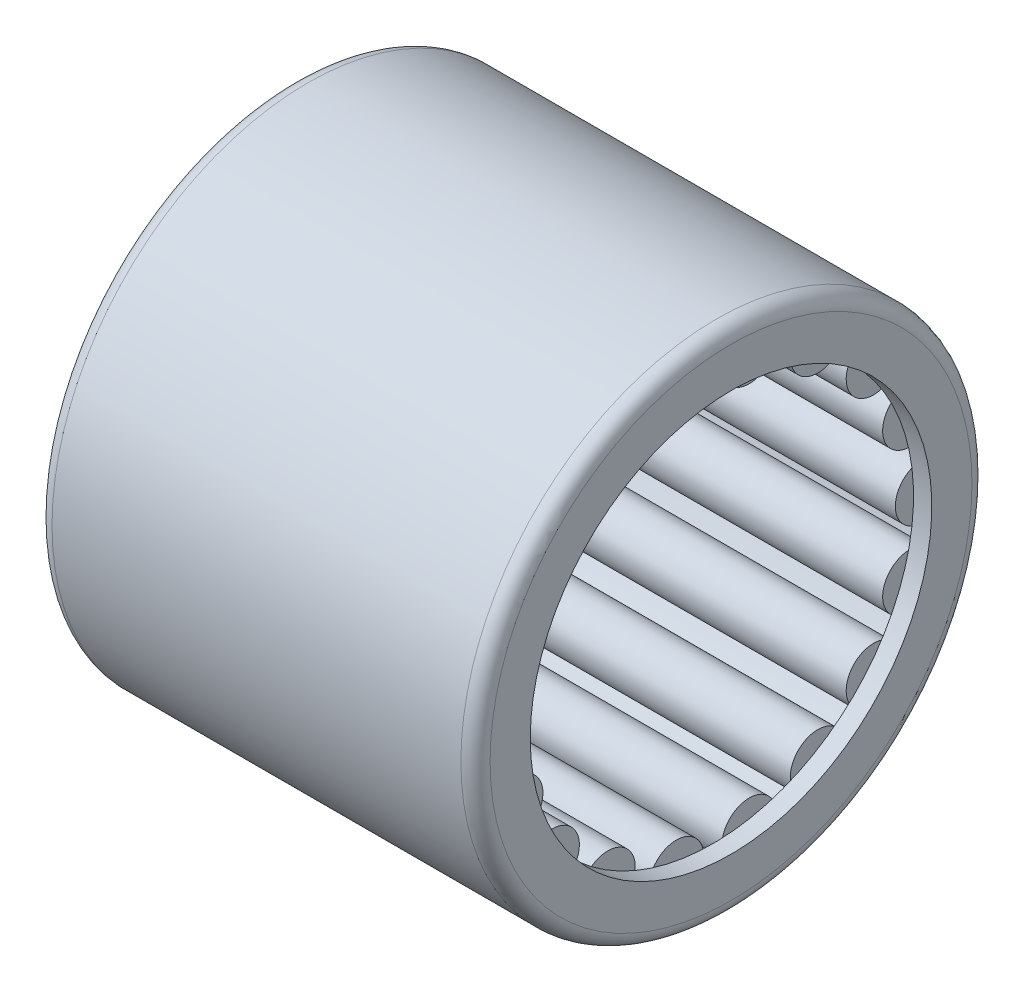
ISO-10303-21;
HEADER;
FILE_DESCRIPTION(('STEP AP214'),'2;1');
FILE_NAME('part.step','',(''),(''),'','','');
FILE_SCHEMA(('AUTOMOTIVE_DESIGN { 1 0 10303 214 1 1 1 1 }'));
ENDSEC;
DATA;
#1=APPLICATION_CONTEXT('core data for automotive mechanical design processes');
#2=APPLICATION_PROTOCOL_DEFINITION('international standard','automotive_design',2000,#1);
#3=PRODUCT_CONTEXT('',#1,'mechanical');
#4=PRODUCT('Part','Part','',(#3));
#5=PRODUCT_RELATED_PRODUCT_CATEGORY('part','',(#4));
#6=PRODUCT_DEFINITION_FORMATION('','',#4);
#7=PRODUCT_DEFINITION_CONTEXT('part definition',#1,'design');
#8=PRODUCT_DEFINITION('design','',#6,#7);
#9=PRODUCT_DEFINITION_SHAPE('','',#8);
#10=(LENGTH_UNIT() NAMED_UNIT(*) SI_UNIT(.MILLI.,.METRE.));
#11=(NAMED_UNIT(*) PLANE_ANGLE_UNIT() SI_UNIT($,.RADIAN.));
#12=(NAMED_UNIT(*) SI_UNIT($,.STERADIAN.) SOLID_ANGLE_UNIT());
#13=UNCERTAINTY_MEASURE_WITH_UNIT(LENGTH_MEASURE(1.E-05),#10,'distance_accuracy_value','');
#14=(GEOMETRIC_REPRESENTATION_CONTEXT(3) GLOBAL_UNCERTAINTY_ASSIGNED_CONTEXT((#13)) GLOBAL_UNIT_ASSIGNED_CONTEXT((#10,
#11,#12)) REPRESENTATION_CONTEXT('',''));
#15=CARTESIAN_POINT('',(0.,0.,0.));
#16=DIRECTION('',(0.,0.,1.));
#17=DIRECTION('',(1.,0.,0.));
#18=AXIS2_PLACEMENT_3D('',#15,#16,#17);
#19=CARTESIAN_POINT('',(-7.62132034355963,1.96661582412253,-5.403232569519));
#20=DIRECTION('',(1.,0.,0.));
#21=DIRECTION('',(0.,0.342020143325657,-0.939692620785913));
#22=AXIS2_PLACEMENT_3D('',#19,#20,#21);
#23=CYLINDRICAL_SURFACE('',#22,0.75);
#24=CARTESIAN_POINT('',(5.5,1.96661582412253,-5.403232569519));
#25=DIRECTION('',(-1.,0.,0.));
#26=DIRECTION('',(0.,-0.342020143325657,0.939692620785913));
#27=AXIS2_PLACEMENT_3D('',#24,#25,#26);
#28=CIRCLE('',#27,0.75);
#29=CARTESIAN_POINT('',(5.5,1.71010071662828,-4.69846310392956));
#30=VERTEX_POINT('',#29);
#31=EDGE_CURVE('E57',#30,#30,#28,.T.);
#32=ORIENTED_EDGE('',*,*,#31,.T.);
#33=EDGE_LOOP('',(#32));
#34=FACE_BOUND('',#33,.T.);
#35=CARTESIAN_POINT('',(-5.49999999999999,1.96661582412253,-5.403232569519));
#36=DIRECTION('',(-1.,0.,0.));
#37=DIRECTION('',(0.,-0.342020143325657,0.939692620785913));
#38=AXIS2_PLACEMENT_3D('',#35,#36,#37);
#39=CIRCLE('',#38,0.75);
#40=CARTESIAN_POINT('',(-5.49999999999999,1.71010071662828,-4.69846310392956));
#41=VERTEX_POINT('',#40);
#42=EDGE_CURVE('E11',#41,#41,#39,.T.);
#43=ORIENTED_EDGE('',*,*,#42,.F.);
#44=EDGE_LOOP('',(#43));
#45=FACE_BOUND('',#44,.T.);
#46=ADVANCED_FACE('F50',(#34,#45),#23,.T.);
#47=CARTESIAN_POINT('',(5.5,1.96661582412253,-5.403232569519));
#48=DIRECTION('',(-1.,0.,0.));
#49=DIRECTION('',(0.,-0.342020143325657,0.939692620785913));
#50=AXIS2_PLACEMENT_3D('',#47,#48,#49);
#51=PLANE('',#50);
#52=ORIENTED_EDGE('',*,*,#31,.F.);
#53=EDGE_LOOP('',(#52));
#54=FACE_BOUND('',#53,.T.);
#55=ADVANCED_FACE('F65',(#54),#51,.F.);
#56=CARTESIAN_POINT('',(-5.49999999999999,5.16830941432251,1.88111078829111));
#57=DIRECTION('',(-1.,0.,0.));
#58=DIRECTION('',(0.,-0.342020143325657,0.939692620785913));
#59=AXIS2_PLACEMENT_3D('',#56,#57,#58);
#60=PLANE('',#59);
#61=ORIENTED_EDGE('',*,*,#42,.T.);
#62=EDGE_LOOP('',(#61));
#63=FACE_BOUND('',#62,.T.);
#64=ADVANCED_FACE('F52',(#63),#60,.T.);
#65=CLOSED_SHELL('',(#46,#55,#64));
#66=MANIFOLD_SOLID_BREP('B2',#65);
#67=CARTESIAN_POINT('',(-7.62132034355963,3.69602875569755,-4.40475554793417));
#68=DIRECTION('',(1.,0.,0.));
#69=DIRECTION('',(0.,0.64278760968653,-0.766044443118986));
#70=AXIS2_PLACEMENT_3D('',#67,#68,#69);
#71=CYLINDRICAL_SURFACE('',#70,0.75);
#72=CARTESIAN_POINT('',(5.5,3.69602875569755,-4.40475554793417));
#73=DIRECTION('',(-1.,0.,0.));
#74=DIRECTION('',(0.,-0.64278760968653,0.766044443118986));
#75=AXIS2_PLACEMENT_3D('',#72,#73,#74);
#76=CIRCLE('',#75,0.75);
#77=CARTESIAN_POINT('',(5.5,3.21393804843265,-3.83022221559493));
#78=VERTEX_POINT('',#77);
#79=EDGE_CURVE('E112',#78,#78,#76,.T.);
#80=ORIENTED_EDGE('',*,*,#79,.T.);
#81=EDGE_LOOP('',(#80));
#82=FACE_BOUND('',#81,.T.);
#83=CARTESIAN_POINT('',(-5.49999999999999,3.69602875569755,-4.40475554793417));
#84=DIRECTION('',(-1.,0.,0.));
#85=DIRECTION('',(0.,-0.64278760968653,0.766044443118986));
#86=AXIS2_PLACEMENT_3D('',#83,#84,#85);
#87=CIRCLE('',#86,0.75);
#88=CARTESIAN_POINT('',(-5.49999999999999,3.21393804843265,-3.83022221559493));
#89=VERTEX_POINT('',#88);
#90=EDGE_CURVE('E49',#89,#89,#87,.T.);
#91=ORIENTED_EDGE('',*,*,#90,.F.);
#92=EDGE_LOOP('',(#91));
#93=FACE_BOUND('',#92,.T.);
#94=ADVANCED_FACE('F105',(#82,#93),#71,.T.);
#95=CARTESIAN_POINT('',(5.5,3.69602875569755,-4.40475554793417));
#96=DIRECTION('',(-1.,0.,0.));
#97=DIRECTION('',(0.,-0.64278760968653,0.766044443118986));
#98=AXIS2_PLACEMENT_3D('',#95,#96,#97);
#99=PLANE('',#98);
#100=ORIENTED_EDGE('',*,*,#79,.F.);
#101=EDGE_LOOP('',(#100));
#102=FACE_BOUND('',#101,.T.);
#103=ADVANCED_FACE('F120',(#102),#99,.F.);
#104=CARTESIAN_POINT('',(-5.49999999999999,4.21324443715442,3.53533185327591));
#105=DIRECTION('',(-1.,0.,0.));
#106=DIRECTION('',(0.,-0.64278760968653,0.766044443118986));
#107=AXIS2_PLACEMENT_3D('',#104,#105,#106);
#108=PLANE('',#107);
#109=ORIENTED_EDGE('',*,*,#90,.T.);
#110=EDGE_LOOP('',(#109));
#111=FACE_BOUND('',#110,.T.);
#112=ADVANCED_FACE('F107',(#111),#108,.T.);
#113=CLOSED_SHELL('',(#94,#103,#112));
#114=MANIFOLD_SOLID_BREP('B6',#113);
#115=CARTESIAN_POINT('',(-7.62132034355963,4.97964607176049,-2.87500000000006));
#116=DIRECTION('',(1.,0.,0.));
#117=DIRECTION('',(0.,0.866025403784433,-0.50000000000001));
#118=AXIS2_PLACEMENT_3D('',#115,#116,#117);
#119=CYLINDRICAL_SURFACE('',#118,0.75);
#120=CARTESIAN_POINT('',(5.5,4.97964607176049,-2.87500000000006));
#121=DIRECTION('',(-1.,0.,0.));
#122=DIRECTION('',(0.,-0.866025403784433,0.50000000000001));
#123=AXIS2_PLACEMENT_3D('',#120,#121,#122);
#124=CIRCLE('',#123,0.75);
#125=CARTESIAN_POINT('',(5.5,4.33012701892216,-2.50000000000005));
#126=VERTEX_POINT('',#125);
#127=EDGE_CURVE('E167',#126,#126,#124,.T.);
#128=ORIENTED_EDGE('',*,*,#127,.T.);
#129=EDGE_LOOP('',(#128));
#130=FACE_BOUND('',#129,.T.);
#131=CARTESIAN_POINT('',(-5.49999999999999,4.97964607176049,-2.87500000000006));
#132=DIRECTION('',(-1.,0.,0.));
#133=DIRECTION('',(0.,-0.866025403784433,0.50000000000001));
#134=AXIS2_PLACEMENT_3D('',#131,#132,#133);
#135=CIRCLE('',#134,0.75);
#136=CARTESIAN_POINT('',(-5.49999999999999,4.33012701892216,-2.50000000000005));
#137=VERTEX_POINT('',#136);
#138=EDGE_CURVE('E104',#137,#137,#135,.T.);
#139=ORIENTED_EDGE('',*,*,#138,.F.);
#140=EDGE_LOOP('',(#139));
#141=FACE_BOUND('',#140,.T.);
#142=ADVANCED_FACE('F160',(#130,#141),#119,.T.);
#143=CARTESIAN_POINT('',(5.5,4.97964607176049,-2.87500000000006));
#144=DIRECTION('',(-1.,0.,0.));
#145=DIRECTION('',(0.,-0.866025403784433,0.50000000000001));
#146=AXIS2_PLACEMENT_3D('',#143,#144,#145);
#147=PLANE('',#146);
#148=ORIENTED_EDGE('',*,*,#127,.F.);
#149=EDGE_LOOP('',(#148));
#150=FACE_BOUND('',#149,.T.);
#151=ADVANCED_FACE('F175',(#150),#147,.F.);
#152=CARTESIAN_POINT('',(-5.49999999999999,2.75000000000005,4.76313972081437));
#153=DIRECTION('',(-1.,0.,0.));
#154=DIRECTION('',(0.,-0.866025403784433,0.50000000000001));
#155=AXIS2_PLACEMENT_3D('',#152,#153,#154);
#156=PLANE('',#155);
#157=ORIENTED_EDGE('',*,*,#138,.T.);
#158=EDGE_LOOP('',(#157));
#159=FACE_BOUND('',#158,.T.);
#160=ADVANCED_FACE('F162',(#159),#156,.T.);
#161=CLOSED_SHELL('',(#142,#151,#160));
#162=MANIFOLD_SOLID_BREP('B44',#161);
#163=CARTESIAN_POINT('',(-7.62132034355963,5.66264457982018,-0.998477021584907));
#164=DIRECTION('',(1.,0.,0.));
#165=DIRECTION('',(0.,0.984807753012206,-0.17364817766694));
#166=AXIS2_PLACEMENT_3D('',#163,#164,#165);
#167=CYLINDRICAL_SURFACE('',#166,0.75);
#168=CARTESIAN_POINT('',(5.5,5.66264457982018,-0.998477021584907));
#169=DIRECTION('',(-1.,0.,0.));
#170=DIRECTION('',(0.,-0.984807753012206,0.17364817766694));
#171=AXIS2_PLACEMENT_3D('',#168,#169,#170);
#172=CIRCLE('',#171,0.75);
#173=CARTESIAN_POINT('',(5.5,4.92403876506103,-0.868240888334702));
#174=VERTEX_POINT('',#173);
#175=EDGE_CURVE('E222',#174,#174,#172,.T.);
#176=ORIENTED_EDGE('',*,*,#175,.T.);
#177=EDGE_LOOP('',(#176));
#178=FACE_BOUND('',#177,.T.);
#179=CARTESIAN_POINT('',(-5.49999999999999,5.66264457982018,-0.998477021584907));
#180=DIRECTION('',(-1.,0.,0.));
#181=DIRECTION('',(0.,-0.984807753012206,0.17364817766694));
#182=AXIS2_PLACEMENT_3D('',#179,#180,#181);
#183=CIRCLE('',#182,0.75);
#184=CARTESIAN_POINT('',(-5.49999999999999,4.92403876506103,-0.868240888334702));
#185=VERTEX_POINT('',#184);
#186=EDGE_CURVE('E159',#185,#185,#183,.T.);
#187=ORIENTED_EDGE('',*,*,#186,.F.);
#188=EDGE_LOOP('',(#187));
#189=FACE_BOUND('',#188,.T.);
#190=ADVANCED_FACE('F215',(#178,#189),#167,.T.);
#191=CARTESIAN_POINT('',(5.5,5.66264457982018,-0.998477021584907));
#192=DIRECTION('',(-1.,0.,0.));
#193=DIRECTION('',(0.,-0.984807753012206,0.17364817766694));
#194=AXIS2_PLACEMENT_3D('',#191,#192,#193);
#195=PLANE('',#194);
#196=ORIENTED_EDGE('',*,*,#175,.F.);
#197=EDGE_LOOP('',(#196));
#198=FACE_BOUND('',#197,.T.);
#199=ADVANCED_FACE('F230',(#198),#195,.F.);
#200=CARTESIAN_POINT('',(-5.49999999999999,0.955064977168171,5.41644264156713));
#201=DIRECTION('',(-1.,0.,0.));
#202=DIRECTION('',(0.,-0.984807753012206,0.17364817766694));
#203=AXIS2_PLACEMENT_3D('',#200,#201,#202);
#204=PLANE('',#203);
#205=ORIENTED_EDGE('',*,*,#186,.T.);
#206=EDGE_LOOP('',(#205));
#207=FACE_BOUND('',#206,.T.);
#208=ADVANCED_FACE('F217',(#207),#204,.T.);
#209=CLOSED_SHELL('',(#190,#199,#208));
#210=MANIFOLD_SOLID_BREP('B99',#209);
#211=CARTESIAN_POINT('',(-7.62132034355963,5.6626445798202,0.998477021584793));
#212=DIRECTION('',(1.,0.,0.));
#213=DIRECTION('',(0.,0.98480775301221,0.173648177666921));
#214=AXIS2_PLACEMENT_3D('',#211,#212,#213);
#215=CYLINDRICAL_SURFACE('',#214,0.75);
#216=CARTESIAN_POINT('',(5.5,5.6626445798202,0.998477021584793));
#217=DIRECTION('',(-1.,0.,0.));
#218=DIRECTION('',(0.,-0.98480775301221,-0.173648177666921));
#219=AXIS2_PLACEMENT_3D('',#216,#217,#218);
#220=CIRCLE('',#219,0.75);
#221=CARTESIAN_POINT('',(5.5,4.92403876506105,0.868240888334603));
#222=VERTEX_POINT('',#221);
#223=EDGE_CURVE('E277',#222,#222,#220,.T.);
#224=ORIENTED_EDGE('',*,*,#223,.T.);
#225=EDGE_LOOP('',(#224));
#226=FACE_BOUND('',#225,.T.);
#227=CARTESIAN_POINT('',(-5.49999999999999,5.6626445798202,0.998477021584793));
#228=DIRECTION('',(-1.,0.,0.));
#229=DIRECTION('',(0.,-0.98480775301221,-0.173648177666921));
#230=AXIS2_PLACEMENT_3D('',#227,#228,#229);
#231=CIRCLE('',#230,0.75);
#232=CARTESIAN_POINT('',(-5.49999999999999,4.92403876506105,0.868240888334603));
#233=VERTEX_POINT('',#232);
#234=EDGE_CURVE('E214',#233,#233,#231,.T.);
#235=ORIENTED_EDGE('',*,*,#234,.F.);
#236=EDGE_LOOP('',(#235));
#237=FACE_BOUND('',#236,.T.);
#238=ADVANCED_FACE('F270',(#226,#237),#215,.T.);
#239=CARTESIAN_POINT('',(5.5,5.6626445798202,0.998477021584793));
#240=DIRECTION('',(-1.,0.,0.));
#241=DIRECTION('',(0.,-0.98480775301221,-0.173648177666921));
#242=AXIS2_PLACEMENT_3D('',#239,#240,#241);
#243=PLANE('',#242);
#244=ORIENTED_EDGE('',*,*,#223,.F.);
#245=EDGE_LOOP('',(#244));
#246=FACE_BOUND('',#245,.T.);
#247=ADVANCED_FACE('F285',(#246),#243,.F.);
#248=CARTESIAN_POINT('',(-5.49999999999999,-0.955064977168062,5.41644264156715));
#249=DIRECTION('',(-1.,0.,0.));
#250=DIRECTION('',(0.,-0.98480775301221,-0.173648177666921));
#251=AXIS2_PLACEMENT_3D('',#248,#249,#250);
#252=PLANE('',#251);
#253=ORIENTED_EDGE('',*,*,#234,.T.);
#254=EDGE_LOOP('',(#253));
#255=FACE_BOUND('',#254,.T.);
#256=ADVANCED_FACE('F272',(#255),#252,.T.);
#257=CLOSED_SHELL('',(#238,#247,#256));
#258=MANIFOLD_SOLID_BREP('B154',#257);
#259=CARTESIAN_POINT('',(-7.62132034355963,4.97964607176055,2.87499999999995));
#260=DIRECTION('',(1.,0.,0.));
#261=DIRECTION('',(0.,0.866025403784443,0.499999999999992));
#262=AXIS2_PLACEMENT_3D('',#259,#260,#261);
#263=CYLINDRICAL_SURFACE('',#262,0.75);
#264=CARTESIAN_POINT('',(5.5,4.97964607176055,2.87499999999995));
#265=DIRECTION('',(-1.,0.,0.));
#266=DIRECTION('',(0.,-0.866025403784443,-0.499999999999992));
#267=AXIS2_PLACEMENT_3D('',#264,#265,#266);
#268=CIRCLE('',#267,0.75);
#269=CARTESIAN_POINT('',(5.5,4.33012701892221,2.49999999999996));
#270=VERTEX_POINT('',#269);
#271=EDGE_CURVE('E332',#270,#270,#268,.T.);
#272=ORIENTED_EDGE('',*,*,#271,.T.);
#273=EDGE_LOOP('',(#272));
#274=FACE_BOUND('',#273,.T.);
#275=CARTESIAN_POINT('',(-5.49999999999999,4.97964607176055,2.87499999999995));
#276=DIRECTION('',(-1.,0.,0.));
#277=DIRECTION('',(0.,-0.866025403784443,-0.499999999999992));
#278=AXIS2_PLACEMENT_3D('',#275,#276,#277);
#279=CIRCLE('',#278,0.75);
#280=CARTESIAN_POINT('',(-5.49999999999999,4.33012701892221,2.49999999999996));
#281=VERTEX_POINT('',#280);
#282=EDGE_CURVE('E269',#281,#281,#279,.T.);
#283=ORIENTED_EDGE('',*,*,#282,.F.);
#284=EDGE_LOOP('',(#283));
#285=FACE_BOUND('',#284,.T.);
#286=ADVANCED_FACE('F325',(#274,#285),#263,.T.);
#287=CARTESIAN_POINT('',(5.5,4.97964607176055,2.87499999999995));
#288=DIRECTION('',(-1.,0.,0.));
#289=DIRECTION('',(0.,-0.866025403784443,-0.499999999999992));
#290=AXIS2_PLACEMENT_3D('',#287,#288,#289);
#291=PLANE('',#290);
#292=ORIENTED_EDGE('',*,*,#271,.F.);
#293=EDGE_LOOP('',(#292));
#294=FACE_BOUND('',#293,.T.);
#295=ADVANCED_FACE('F340',(#294),#291,.F.);
#296=CARTESIAN_POINT('',(-5.49999999999999,-2.74999999999995,4.76313972081443));
#297=DIRECTION('',(-1.,0.,0.));
#298=DIRECTION('',(0.,-0.866025403784443,-0.499999999999992));
#299=AXIS2_PLACEMENT_3D('',#296,#297,#298);
#300=PLANE('',#299);
#301=ORIENTED_EDGE('',*,*,#282,.T.);
#302=EDGE_LOOP('',(#301));
#303=FACE_BOUND('',#302,.T.);
#304=ADVANCED_FACE('F327',(#303),#300,.T.);
#305=CLOSED_SHELL('',(#286,#295,#304));
#306=MANIFOLD_SOLID_BREP('B209',#305);
#307=CARTESIAN_POINT('',(-7.62132034355963,3.69602875569764,4.40475554793409));
#308=DIRECTION('',(1.,0.,0.));
#309=DIRECTION('',(0.,0.642787609686546,0.766044443118973));
#310=AXIS2_PLACEMENT_3D('',#307,#308,#309);
#311=CYLINDRICAL_SURFACE('',#310,0.75);
#312=CARTESIAN_POINT('',(5.5,3.69602875569764,4.40475554793409));
#313=DIRECTION('',(-1.,0.,0.));
#314=DIRECTION('',(0.,-0.642787609686546,-0.766044443118973));
#315=AXIS2_PLACEMENT_3D('',#312,#313,#314);
#316=CIRCLE('',#315,0.75);
#317=CARTESIAN_POINT('',(5.5,3.21393804843273,3.83022221559486));
#318=VERTEX_POINT('',#317);
#319=EDGE_CURVE('E387',#318,#318,#316,.T.);
#320=ORIENTED_EDGE('',*,*,#319,.T.);
#321=EDGE_LOOP('',(#320));
#322=FACE_BOUND('',#321,.T.);
#323=CARTESIAN_POINT('',(-5.49999999999999,3.69602875569764,4.40475554793409));
#324=DIRECTION('',(-1.,0.,0.));
#325=DIRECTION('',(0.,-0.642787609686546,-0.766044443118973));
#326=AXIS2_PLACEMENT_3D('',#323,#324,#325);
#327=CIRCLE('',#326,0.75);
#328=CARTESIAN_POINT('',(-5.49999999999999,3.21393804843273,3.83022221559486));
#329=VERTEX_POINT('',#328);
#330=EDGE_CURVE('E324',#329,#329,#327,.T.);
#331=ORIENTED_EDGE('',*,*,#330,.F.);
#332=EDGE_LOOP('',(#331));
#333=FACE_BOUND('',#332,.T.);
#334=ADVANCED_FACE('F380',(#322,#333),#311,.T.);
#335=CARTESIAN_POINT('',(5.5,3.69602875569764,4.40475554793409));
#336=DIRECTION('',(-1.,0.,0.));
#337=DIRECTION('',(0.,-0.642787609686546,-0.766044443118973));
#338=AXIS2_PLACEMENT_3D('',#335,#336,#337);
#339=PLANE('',#338);
#340=ORIENTED_EDGE('',*,*,#319,.F.);
#341=EDGE_LOOP('',(#340));
#342=FACE_BOUND('',#341,.T.);
#343=ADVANCED_FACE('F395',(#342),#339,.F.);
#344=CARTESIAN_POINT('',(-5.49999999999999,-4.21324443715434,3.535331853276));
#345=DIRECTION('',(-1.,0.,0.));
#346=DIRECTION('',(0.,-0.642787609686546,-0.766044443118973));
#347=AXIS2_PLACEMENT_3D('',#344,#345,#346);
#348=PLANE('',#347);
#349=ORIENTED_EDGE('',*,*,#330,.T.);
#350=EDGE_LOOP('',(#349));
#351=FACE_BOUND('',#350,.T.);
#352=ADVANCED_FACE('F382',(#351),#348,.T.);
#353=CLOSED_SHELL('',(#334,#343,#352));
#354=MANIFOLD_SOLID_BREP('B264',#353);
#355=CARTESIAN_POINT('',(-7.62132034355963,1.96661582412263,5.40323256951896));
#356=DIRECTION('',(1.,0.,0.));
#357=DIRECTION('',(0.,0.342020143325676,0.939692620785906));
#358=AXIS2_PLACEMENT_3D('',#355,#356,#357);
#359=CYLINDRICAL_SURFACE('',#358,0.75);
#360=CARTESIAN_POINT('',(5.5,1.96661582412263,5.40323256951896));
#361=DIRECTION('',(-1.,0.,0.));
#362=DIRECTION('',(0.,-0.342020143325676,-0.939692620785906));
#363=AXIS2_PLACEMENT_3D('',#360,#361,#362);
#364=CIRCLE('',#363,0.75);
#365=CARTESIAN_POINT('',(5.5,1.71010071662838,4.69846310392953));
#366=VERTEX_POINT('',#365);
#367=EDGE_CURVE('E442',#366,#366,#364,.T.);
#368=ORIENTED_EDGE('',*,*,#367,.T.);
#369=EDGE_LOOP('',(#368));
#370=FACE_BOUND('',#369,.T.);
#371=CARTESIAN_POINT('',(-5.49999999999999,1.96661582412263,5.40323256951896));
#372=DIRECTION('',(-1.,0.,0.));
#373=DIRECTION('',(0.,-0.342020143325676,-0.939692620785906));
#374=AXIS2_PLACEMENT_3D('',#371,#372,#373);
#375=CIRCLE('',#374,0.75);
#376=CARTESIAN_POINT('',(-5.49999999999999,1.71010071662838,4.69846310392953));
#377=VERTEX_POINT('',#376);
#378=EDGE_CURVE('E379',#377,#377,#375,.T.);
#379=ORIENTED_EDGE('',*,*,#378,.F.);
#380=EDGE_LOOP('',(#379));
#381=FACE_BOUND('',#380,.T.);
#382=ADVANCED_FACE('F435',(#370,#381),#359,.T.);
#383=CARTESIAN_POINT('',(5.5,1.96661582412263,5.40323256951896));
#384=DIRECTION('',(-1.,0.,0.));
#385=DIRECTION('',(0.,-0.342020143325676,-0.939692620785906));
#386=AXIS2_PLACEMENT_3D('',#383,#384,#385);
#387=PLANE('',#386);
#388=ORIENTED_EDGE('',*,*,#367,.F.);
#389=EDGE_LOOP('',(#388));
#390=FACE_BOUND('',#389,.T.);
#391=ADVANCED_FACE('F450',(#390),#387,.F.);
#392=CARTESIAN_POINT('',(-5.49999999999999,-5.16830941432247,1.88111078829121));
#393=DIRECTION('',(-1.,0.,0.));
#394=DIRECTION('',(0.,-0.342020143325676,-0.939692620785906));
#395=AXIS2_PLACEMENT_3D('',#392,#393,#394);
#396=PLANE('',#395);
#397=ORIENTED_EDGE('',*,*,#378,.T.);
#398=EDGE_LOOP('',(#397));
#399=FACE_BOUND('',#398,.T.);
#400=ADVANCED_FACE('F437',(#399),#396,.T.);
#401=CLOSED_SHELL('',(#382,#391,#400));
#402=MANIFOLD_SOLID_BREP('B319',#401);
#403=CARTESIAN_POINT('',(-7.62132034355963,0.,5.75));
#404=DIRECTION('',(1.,0.,0.));
#405=DIRECTION('',(0.,0.,1.));
#406=AXIS2_PLACEMENT_3D('',#403,#404,#405);
#407=CYLINDRICAL_SURFACE('',#406,0.75);
#408=CARTESIAN_POINT('',(5.5,0.,5.75));
#409=DIRECTION('',(-1.,0.,0.));
#410=DIRECTION('',(0.,0.,-1.));
#411=AXIS2_PLACEMENT_3D('',#408,#409,#410);
#412=CIRCLE('',#411,0.75);
#413=CARTESIAN_POINT('',(5.5,0.,5.));
#414=VERTEX_POINT('',#413);
#415=EDGE_CURVE('E497',#414,#414,#412,.T.);
#416=ORIENTED_EDGE('',*,*,#415,.T.);
#417=EDGE_LOOP('',(#416));
#418=FACE_BOUND('',#417,.T.);
#419=CARTESIAN_POINT('',(-5.49999999999999,0.,5.75));
#420=DIRECTION('',(-1.,0.,0.));
#421=DIRECTION('',(0.,0.,-1.));
#422=AXIS2_PLACEMENT_3D('',#419,#420,#421);
#423=CIRCLE('',#422,0.75);
#424=CARTESIAN_POINT('',(-5.49999999999999,0.,5.));
#425=VERTEX_POINT('',#424);
#426=EDGE_CURVE('E434',#425,#425,#423,.T.);
#427=ORIENTED_EDGE('',*,*,#426,.F.);
#428=EDGE_LOOP('',(#427));
#429=FACE_BOUND('',#428,.T.);
#430=ADVANCED_FACE('F490',(#418,#429),#407,.T.);
#431=CARTESIAN_POINT('',(5.5,0.,5.75));
#432=DIRECTION('',(-1.,0.,0.));
#433=DIRECTION('',(0.,0.,-1.));
#434=AXIS2_PLACEMENT_3D('',#431,#432,#433);
#435=PLANE('',#434);
#436=ORIENTED_EDGE('',*,*,#415,.F.);
#437=EDGE_LOOP('',(#436));
#438=FACE_BOUND('',#437,.T.);
#439=ADVANCED_FACE('F505',(#438),#435,.F.);
#440=CARTESIAN_POINT('',(-5.49999999999999,-5.49999999999999,0.));
#441=DIRECTION('',(-1.,0.,0.));
#442=DIRECTION('',(0.,0.,-1.));
#443=AXIS2_PLACEMENT_3D('',#440,#441,#442);
#444=PLANE('',#443);
#445=ORIENTED_EDGE('',*,*,#426,.T.);
#446=EDGE_LOOP('',(#445));
#447=FACE_BOUND('',#446,.T.);
#448=ADVANCED_FACE('F492',(#447),#444,.T.);
#449=CLOSED_SHELL('',(#430,#439,#448));
#450=MANIFOLD_SOLID_BREP('B374',#449);
#451=CARTESIAN_POINT('',(-7.62132034355963,-1.96661582412256,5.40323256951898));
#452=DIRECTION('',(1.,0.,0.));
#453=DIRECTION('',(0.,-0.342020143325663,0.939692620785911));
#454=AXIS2_PLACEMENT_3D('',#451,#452,#453);
#455=CYLINDRICAL_SURFACE('',#454,0.75);
#456=CARTESIAN_POINT('',(5.5,-1.96661582412256,5.40323256951898));
#457=DIRECTION('',(-1.,0.,0.));
#458=DIRECTION('',(0.,0.342020143325663,-0.939692620785911));
#459=AXIS2_PLACEMENT_3D('',#456,#457,#458);
#460=CIRCLE('',#459,0.75);
#461=CARTESIAN_POINT('',(5.5,-1.71010071662831,4.69846310392955));
#462=VERTEX_POINT('',#461);
#463=EDGE_CURVE('E552',#462,#462,#460,.T.);
#464=ORIENTED_EDGE('',*,*,#463,.T.);
#465=EDGE_LOOP('',(#464));
#466=FACE_BOUND('',#465,.T.);
#467=CARTESIAN_POINT('',(-5.49999999999999,-1.96661582412256,5.40323256951898));
#468=DIRECTION('',(-1.,0.,0.));
#469=DIRECTION('',(0.,0.342020143325663,-0.939692620785911));
#470=AXIS2_PLACEMENT_3D('',#467,#468,#469);
#471=CIRCLE('',#470,0.75);
#472=CARTESIAN_POINT('',(-5.49999999999999,-1.71010071662831,4.69846310392955));
#473=VERTEX_POINT('',#472);
#474=EDGE_CURVE('E489',#473,#473,#471,.T.);
#475=ORIENTED_EDGE('',*,*,#474,.F.);
#476=EDGE_LOOP('',(#475));
#477=FACE_BOUND('',#476,.T.);
#478=ADVANCED_FACE('F545',(#466,#477),#455,.T.);
#479=CARTESIAN_POINT('',(5.5,-1.96661582412256,5.40323256951898));
#480=DIRECTION('',(-1.,0.,0.));
#481=DIRECTION('',(0.,0.342020143325663,-0.939692620785911));
#482=AXIS2_PLACEMENT_3D('',#479,#480,#481);
#483=PLANE('',#482);
#484=ORIENTED_EDGE('',*,*,#463,.F.);
#485=EDGE_LOOP('',(#484));
#486=FACE_BOUND('',#485,.T.);
#487=ADVANCED_FACE('F560',(#486),#483,.F.);
#488=CARTESIAN_POINT('',(-5.49999999999999,-5.1683094143225,-1.88111078829114));
#489=DIRECTION('',(-1.,0.,0.));
#490=DIRECTION('',(0.,0.342020143325663,-0.939692620785911));
#491=AXIS2_PLACEMENT_3D('',#488,#489,#490);
#492=PLANE('',#491);
#493=ORIENTED_EDGE('',*,*,#474,.T.);
#494=EDGE_LOOP('',(#493));
#495=FACE_BOUND('',#494,.T.);
#496=ADVANCED_FACE('F547',(#495),#492,.T.);
#497=CLOSED_SHELL('',(#478,#487,#496));
#498=MANIFOLD_SOLID_BREP('B429',#497);
#499=CARTESIAN_POINT('',(-7.62132034355963,-3.69602875569758,4.40475554793414));
#500=DIRECTION('',(1.,0.,0.));
#501=DIRECTION('',(0.,-0.642787609686535,0.766044443118981));
#502=AXIS2_PLACEMENT_3D('',#499,#500,#501);
#503=CYLINDRICAL_SURFACE('',#502,0.75);
#504=CARTESIAN_POINT('',(5.5,-3.69602875569758,4.40475554793414));
#505=DIRECTION('',(-1.,0.,0.));
#506=DIRECTION('',(0.,0.642787609686535,-0.766044443118981));
#507=AXIS2_PLACEMENT_3D('',#504,#505,#506);
#508=CIRCLE('',#507,0.75);
#509=CARTESIAN_POINT('',(5.5,-3.21393804843267,3.8302222155949));
#510=VERTEX_POINT('',#509);
#511=EDGE_CURVE('E607',#510,#510,#508,.T.);
#512=ORIENTED_EDGE('',*,*,#511,.T.);
#513=EDGE_LOOP('',(#512));
#514=FACE_BOUND('',#513,.T.);
#515=CARTESIAN_POINT('',(-5.49999999999999,-3.69602875569758,4.40475554793414));
#516=DIRECTION('',(-1.,0.,0.));
#517=DIRECTION('',(0.,0.642787609686535,-0.766044443118981));
#518=AXIS2_PLACEMENT_3D('',#515,#516,#517);
#519=CIRCLE('',#518,0.75);
#520=CARTESIAN_POINT('',(-5.49999999999999,-3.21393804843267,3.8302222155949));
#521=VERTEX_POINT('',#520);
#522=EDGE_CURVE('E544',#521,#521,#519,.T.);
#523=ORIENTED_EDGE('',*,*,#522,.F.);
#524=EDGE_LOOP('',(#523));
#525=FACE_BOUND('',#524,.T.);
#526=ADVANCED_FACE('F600',(#514,#525),#503,.T.);
#527=CARTESIAN_POINT('',(5.5,-3.69602875569758,4.40475554793414));
#528=DIRECTION('',(-1.,0.,0.));
#529=DIRECTION('',(0.,0.642787609686535,-0.766044443118981));
#530=AXIS2_PLACEMENT_3D('',#527,#528,#529);
#531=PLANE('',#530);
#532=ORIENTED_EDGE('',*,*,#511,.F.);
#533=EDGE_LOOP('',(#532));
#534=FACE_BOUND('',#533,.T.);
#535=ADVANCED_FACE('F615',(#534),#531,.F.);
#536=CARTESIAN_POINT('',(-5.49999999999999,-4.21324443715439,-3.53533185327594));
#537=DIRECTION('',(-1.,0.,0.));
#538=DIRECTION('',(0.,0.642787609686535,-0.766044443118981));
#539=AXIS2_PLACEMENT_3D('',#536,#537,#538);
#540=PLANE('',#539);
#541=ORIENTED_EDGE('',*,*,#522,.T.);
#542=EDGE_LOOP('',(#541));
#543=FACE_BOUND('',#542,.T.);
#544=ADVANCED_FACE('F602',(#543),#540,.T.);
#545=CLOSED_SHELL('',(#526,#535,#544));
#546=MANIFOLD_SOLID_BREP('B484',#545);
#547=CARTESIAN_POINT('',(-7.62132034355963,-4.97964607176051,2.87500000000002));
#548=DIRECTION('',(1.,0.,0.));
#549=DIRECTION('',(0.,-0.866025403784436,0.500000000000004));
#550=AXIS2_PLACEMENT_3D('',#547,#548,#549);
#551=CYLINDRICAL_SURFACE('',#550,0.75);
#552=CARTESIAN_POINT('',(5.5,-4.97964607176051,2.87500000000002));
#553=DIRECTION('',(-1.,0.,0.));
#554=DIRECTION('',(0.,0.866025403784436,-0.500000000000004));
#555=AXIS2_PLACEMENT_3D('',#552,#553,#554);
#556=CIRCLE('',#555,0.75);
#557=CARTESIAN_POINT('',(5.5,-4.33012701892218,2.50000000000002));
#558=VERTEX_POINT('',#557);
#559=EDGE_CURVE('E662',#558,#558,#556,.T.);
#560=ORIENTED_EDGE('',*,*,#559,.T.);
#561=EDGE_LOOP('',(#560));
#562=FACE_BOUND('',#561,.T.);
#563=CARTESIAN_POINT('',(-5.49999999999999,-4.97964607176051,2.87500000000002));
#564=DIRECTION('',(-1.,0.,0.));
#565=DIRECTION('',(0.,0.866025403784436,-0.500000000000004));
#566=AXIS2_PLACEMENT_3D('',#563,#564,#565);
#567=CIRCLE('',#566,0.75);
#568=CARTESIAN_POINT('',(-5.49999999999999,-4.33012701892218,2.50000000000002));
#569=VERTEX_POINT('',#568);
#570=EDGE_CURVE('E599',#569,#569,#567,.T.);
#571=ORIENTED_EDGE('',*,*,#570,.F.);
#572=EDGE_LOOP('',(#571));
#573=FACE_BOUND('',#572,.T.);
#574=ADVANCED_FACE('F655',(#562,#573),#551,.T.);
#575=CARTESIAN_POINT('',(5.5,-4.97964607176051,2.87500000000002));
#576=DIRECTION('',(-1.,0.,0.));
#577=DIRECTION('',(0.,0.866025403784436,-0.500000000000004));
#578=AXIS2_PLACEMENT_3D('',#575,#576,#577);
#579=PLANE('',#578);
#580=ORIENTED_EDGE('',*,*,#559,.F.);
#581=EDGE_LOOP('',(#580));
#582=FACE_BOUND('',#581,.T.);
#583=ADVANCED_FACE('F670',(#582),#579,.F.);
#584=CARTESIAN_POINT('',(-5.49999999999999,-2.75000000000002,-4.76313972081439));
#585=DIRECTION('',(-1.,0.,0.));
#586=DIRECTION('',(0.,0.866025403784436,-0.500000000000004));
#587=AXIS2_PLACEMENT_3D('',#584,#585,#586);
#588=PLANE('',#587);
#589=ORIENTED_EDGE('',*,*,#570,.T.);
#590=EDGE_LOOP('',(#589));
#591=FACE_BOUND('',#590,.T.);
#592=ADVANCED_FACE('F657',(#591),#588,.T.);
#593=CLOSED_SHELL('',(#574,#583,#592));
#594=MANIFOLD_SOLID_BREP('B539',#593);
#595=CARTESIAN_POINT('',(-7.62132034355963,-5.66264457982019,0.99847702158487));
#596=DIRECTION('',(1.,0.,0.));
#597=DIRECTION('',(0.,-0.984807753012207,0.173648177666934));
#598=AXIS2_PLACEMENT_3D('',#595,#596,#597);
#599=CYLINDRICAL_SURFACE('',#598,0.75);
#600=CARTESIAN_POINT('',(5.5,-5.66264457982019,0.99847702158487));
#601=DIRECTION('',(-1.,0.,0.));
#602=DIRECTION('',(0.,0.984807753012207,-0.173648177666934));
#603=AXIS2_PLACEMENT_3D('',#600,#601,#602);
#604=CIRCLE('',#603,0.75);
#605=CARTESIAN_POINT('',(5.5,-4.92403876506103,0.868240888334669));
#606=VERTEX_POINT('',#605);
#607=EDGE_CURVE('E717',#606,#606,#604,.T.);
#608=ORIENTED_EDGE('',*,*,#607,.T.);
#609=EDGE_LOOP('',(#608));
#610=FACE_BOUND('',#609,.T.);
#611=CARTESIAN_POINT('',(-5.49999999999999,-5.66264457982019,0.99847702158487));
#612=DIRECTION('',(-1.,0.,0.));
#613=DIRECTION('',(0.,0.984807753012207,-0.173648177666934));
#614=AXIS2_PLACEMENT_3D('',#611,#612,#613);
#615=CIRCLE('',#614,0.75);
#616=CARTESIAN_POINT('',(-5.49999999999999,-4.92403876506103,0.868240888334669));
#617=VERTEX_POINT('',#616);
#618=EDGE_CURVE('E654',#617,#617,#615,.T.);
#619=ORIENTED_EDGE('',*,*,#618,.F.);
#620=EDGE_LOOP('',(#619));
#621=FACE_BOUND('',#620,.T.);
#622=ADVANCED_FACE('F710',(#610,#621),#599,.T.);
#623=CARTESIAN_POINT('',(5.5,-5.66264457982019,0.99847702158487));
#624=DIRECTION('',(-1.,0.,0.));
#625=DIRECTION('',(0.,0.984807753012207,-0.173648177666934));
#626=AXIS2_PLACEMENT_3D('',#623,#624,#625);
#627=PLANE('',#626);
#628=ORIENTED_EDGE('',*,*,#607,.F.);
#629=EDGE_LOOP('',(#628));
#630=FACE_BOUND('',#629,.T.);
#631=ADVANCED_FACE('F725',(#630),#627,.F.);
#632=CARTESIAN_POINT('',(-5.49999999999999,-0.955064977168136,-5.41644264156713));
#633=DIRECTION('',(-1.,0.,0.));
#634=DIRECTION('',(0.,0.984807753012207,-0.173648177666934));
#635=AXIS2_PLACEMENT_3D('',#632,#633,#634);
#636=PLANE('',#635);
#637=ORIENTED_EDGE('',*,*,#618,.T.);
#638=EDGE_LOOP('',(#637));
#639=FACE_BOUND('',#638,.T.);
#640=ADVANCED_FACE('F712',(#639),#636,.T.);
#641=CLOSED_SHELL('',(#622,#631,#640));
#642=MANIFOLD_SOLID_BREP('B594',#641);
#643=CARTESIAN_POINT('',(-7.62132034355963,-5.6626445798202,-0.998477021584832));
#644=DIRECTION('',(1.,0.,0.));
#645=DIRECTION('',(0.,-0.984807753012209,-0.173648177666927));
#646=AXIS2_PLACEMENT_3D('',#643,#644,#645);
#647=CYLINDRICAL_SURFACE('',#646,0.75);
#648=CARTESIAN_POINT('',(5.5,-5.6626445798202,-0.998477021584832));
#649=DIRECTION('',(-1.,0.,0.));
#650=DIRECTION('',(0.,0.984807753012209,0.173648177666927));
#651=AXIS2_PLACEMENT_3D('',#648,#649,#650);
#652=CIRCLE('',#651,0.75);
#653=CARTESIAN_POINT('',(5.5,-4.92403876506104,-0.868240888334636));
#654=VERTEX_POINT('',#653);
#655=EDGE_CURVE('E772',#654,#654,#652,.T.);
#656=ORIENTED_EDGE('',*,*,#655,.T.);
#657=EDGE_LOOP('',(#656));
#658=FACE_BOUND('',#657,.T.);
#659=CARTESIAN_POINT('',(-5.49999999999999,-5.6626445798202,-0.998477021584832));
#660=DIRECTION('',(-1.,0.,0.));
#661=DIRECTION('',(0.,0.984807753012209,0.173648177666927));
#662=AXIS2_PLACEMENT_3D('',#659,#660,#661);
#663=CIRCLE('',#662,0.75);
#664=CARTESIAN_POINT('',(-5.49999999999999,-4.92403876506104,-0.868240888334636));
#665=VERTEX_POINT('',#664);
#666=EDGE_CURVE('E709',#665,#665,#663,.T.);
#667=ORIENTED_EDGE('',*,*,#666,.F.);
#668=EDGE_LOOP('',(#667));
#669=FACE_BOUND('',#668,.T.);
#670=ADVANCED_FACE('F765',(#658,#669),#647,.T.);
#671=CARTESIAN_POINT('',(5.5,-5.6626445798202,-0.998477021584832));
#672=DIRECTION('',(-1.,0.,0.));
#673=DIRECTION('',(0.,0.984807753012209,0.173648177666927));
#674=AXIS2_PLACEMENT_3D('',#671,#672,#673);
#675=PLANE('',#674);
#676=ORIENTED_EDGE('',*,*,#655,.F.);
#677=EDGE_LOOP('',(#676));
#678=FACE_BOUND('',#677,.T.);
#679=ADVANCED_FACE('F780',(#678),#675,.F.);
#680=CARTESIAN_POINT('',(-5.49999999999999,0.955064977168099,-5.41644264156714));
#681=DIRECTION('',(-1.,0.,0.));
#682=DIRECTION('',(0.,0.984807753012209,0.173648177666927));
#683=AXIS2_PLACEMENT_3D('',#680,#681,#682);
#684=PLANE('',#683);
#685=ORIENTED_EDGE('',*,*,#666,.T.);
#686=EDGE_LOOP('',(#685));
#687=FACE_BOUND('',#686,.T.);
#688=ADVANCED_FACE('F767',(#687),#684,.T.);
#689=CLOSED_SHELL('',(#670,#679,#688));
#690=MANIFOLD_SOLID_BREP('B649',#689);
#691=CARTESIAN_POINT('',(-7.62132034355963,-4.97964607176053,-2.87499999999999));
#692=DIRECTION('',(1.,0.,0.));
#693=DIRECTION('',(0.,-0.86602540378444,-0.499999999999998));
#694=AXIS2_PLACEMENT_3D('',#691,#692,#693);
#695=CYLINDRICAL_SURFACE('',#694,0.75);
#696=CARTESIAN_POINT('',(5.5,-4.97964607176053,-2.87499999999999));
#697=DIRECTION('',(-1.,0.,0.));
#698=DIRECTION('',(0.,0.86602540378444,0.499999999999998));
#699=AXIS2_PLACEMENT_3D('',#696,#697,#698);
#700=CIRCLE('',#699,0.75);
#701=CARTESIAN_POINT('',(5.5,-4.3301270189222,-2.49999999999999));
#702=VERTEX_POINT('',#701);
#703=EDGE_CURVE('E827',#702,#702,#700,.T.);
#704=ORIENTED_EDGE('',*,*,#703,.T.);
#705=EDGE_LOOP('',(#704));
#706=FACE_BOUND('',#705,.T.);
#707=CARTESIAN_POINT('',(-5.49999999999999,-4.97964607176053,-2.87499999999999));
#708=DIRECTION('',(-1.,0.,0.));
#709=DIRECTION('',(0.,0.86602540378444,0.499999999999998));
#710=AXIS2_PLACEMENT_3D('',#707,#708,#709);
#711=CIRCLE('',#710,0.75);
#712=CARTESIAN_POINT('',(-5.49999999999999,-4.3301270189222,-2.49999999999999));
#713=VERTEX_POINT('',#712);
#714=EDGE_CURVE('E764',#713,#713,#711,.T.);
#715=ORIENTED_EDGE('',*,*,#714,.F.);
#716=EDGE_LOOP('',(#715));
#717=FACE_BOUND('',#716,.T.);
#718=ADVANCED_FACE('F820',(#706,#717),#695,.T.);
#719=CARTESIAN_POINT('',(5.5,-4.97964607176053,-2.87499999999999));
#720=DIRECTION('',(-1.,0.,0.));
#721=DIRECTION('',(0.,0.86602540378444,0.499999999999998));
#722=AXIS2_PLACEMENT_3D('',#719,#720,#721);
#723=PLANE('',#722);
#724=ORIENTED_EDGE('',*,*,#703,.F.);
#725=EDGE_LOOP('',(#724));
#726=FACE_BOUND('',#725,.T.);
#727=ADVANCED_FACE('F835',(#726),#723,.F.);
#728=CARTESIAN_POINT('',(-5.49999999999999,2.74999999999998,-4.76313972081441));
#729=DIRECTION('',(-1.,0.,0.));
#730=DIRECTION('',(0.,0.86602540378444,0.499999999999998));
#731=AXIS2_PLACEMENT_3D('',#728,#729,#730);
#732=PLANE('',#731);
#733=ORIENTED_EDGE('',*,*,#714,.T.);
#734=EDGE_LOOP('',(#733));
#735=FACE_BOUND('',#734,.T.);
#736=ADVANCED_FACE('F822',(#735),#732,.T.);
#737=CLOSED_SHELL('',(#718,#727,#736));
#738=MANIFOLD_SOLID_BREP('B704',#737);
#739=CARTESIAN_POINT('',(-7.62132034355963,-3.69602875569761,-4.40475554793412));
#740=DIRECTION('',(1.,0.,0.));
#741=DIRECTION('',(0.,-0.642787609686541,-0.766044443118977));
#742=AXIS2_PLACEMENT_3D('',#739,#740,#741);
#743=CYLINDRICAL_SURFACE('',#742,0.75);
#744=CARTESIAN_POINT('',(5.5,-3.69602875569761,-4.40475554793412));
#745=DIRECTION('',(-1.,0.,0.));
#746=DIRECTION('',(0.,0.642787609686541,0.766044443118977));
#747=AXIS2_PLACEMENT_3D('',#744,#745,#746);
#748=CIRCLE('',#747,0.75);
#749=CARTESIAN_POINT('',(5.5,-3.2139380484327,-3.83022221559488));
#750=VERTEX_POINT('',#749);
#751=EDGE_CURVE('E882',#750,#750,#748,.T.);
#752=ORIENTED_EDGE('',*,*,#751,.T.);
#753=EDGE_LOOP('',(#752));
#754=FACE_BOUND('',#753,.T.);
#755=CARTESIAN_POINT('',(-5.49999999999999,-3.69602875569761,-4.40475554793412));
#756=DIRECTION('',(-1.,0.,0.));
#757=DIRECTION('',(0.,0.642787609686541,0.766044443118977));
#758=AXIS2_PLACEMENT_3D('',#755,#756,#757);
#759=CIRCLE('',#758,0.75);
#760=CARTESIAN_POINT('',(-5.49999999999999,-3.2139380484327,-3.83022221559488));
#761=VERTEX_POINT('',#760);
#762=EDGE_CURVE('E819',#761,#761,#759,.T.);
#763=ORIENTED_EDGE('',*,*,#762,.F.);
#764=EDGE_LOOP('',(#763));
#765=FACE_BOUND('',#764,.T.);
#766=ADVANCED_FACE('F875',(#754,#765),#743,.T.);
#767=CARTESIAN_POINT('',(5.5,-3.69602875569761,-4.40475554793412));
#768=DIRECTION('',(-1.,0.,0.));
#769=DIRECTION('',(0.,0.642787609686541,0.766044443118977));
#770=AXIS2_PLACEMENT_3D('',#767,#768,#769);
#771=PLANE('',#770);
#772=ORIENTED_EDGE('',*,*,#751,.F.);
#773=EDGE_LOOP('',(#772));
#774=FACE_BOUND('',#773,.T.);
#775=ADVANCED_FACE('F890',(#774),#771,.F.);
#776=CARTESIAN_POINT('',(-5.49999999999999,4.21324443715437,-3.53533185327597));
#777=DIRECTION('',(-1.,0.,0.));
#778=DIRECTION('',(0.,0.642787609686541,0.766044443118977));
#779=AXIS2_PLACEMENT_3D('',#776,#777,#778);
#780=PLANE('',#779);
#781=ORIENTED_EDGE('',*,*,#762,.T.);
#782=EDGE_LOOP('',(#781));
#783=FACE_BOUND('',#782,.T.);
#784=ADVANCED_FACE('F877',(#783),#780,.T.);
#785=CLOSED_SHELL('',(#766,#775,#784));
#786=MANIFOLD_SOLID_BREP('B759',#785);
#787=CARTESIAN_POINT('',(-7.62132034355963,-1.9666158241226,-5.40323256951897));
#788=DIRECTION('',(1.,0.,0.));
#789=DIRECTION('',(0.,-0.342020143325669,-0.939692620785908));
#790=AXIS2_PLACEMENT_3D('',#787,#788,#789);
#791=CYLINDRICAL_SURFACE('',#790,0.75);
#792=CARTESIAN_POINT('',(5.5,-1.9666158241226,-5.40323256951897));
#793=DIRECTION('',(-1.,0.,0.));
#794=DIRECTION('',(0.,0.342020143325669,0.939692620785908));
#795=AXIS2_PLACEMENT_3D('',#792,#793,#794);
#796=CIRCLE('',#795,0.75);
#797=CARTESIAN_POINT('',(5.5,-1.71010071662835,-4.69846310392954));
#798=VERTEX_POINT('',#797);
#799=EDGE_CURVE('E937',#798,#798,#796,.T.);
#800=ORIENTED_EDGE('',*,*,#799,.T.);
#801=EDGE_LOOP('',(#800));
#802=FACE_BOUND('',#801,.T.);
#803=CARTESIAN_POINT('',(-5.49999999999999,-1.9666158241226,-5.40323256951897));
#804=DIRECTION('',(-1.,0.,0.));
#805=DIRECTION('',(0.,0.342020143325669,0.939692620785908));
#806=AXIS2_PLACEMENT_3D('',#803,#804,#805);
#807=CIRCLE('',#806,0.75);
#808=CARTESIAN_POINT('',(-5.49999999999999,-1.71010071662835,-4.69846310392954));
#809=VERTEX_POINT('',#808);
#810=EDGE_CURVE('E874',#809,#809,#807,.T.);
#811=ORIENTED_EDGE('',*,*,#810,.F.);
#812=EDGE_LOOP('',(#811));
#813=FACE_BOUND('',#812,.T.);
#814=ADVANCED_FACE('F930',(#802,#813),#791,.T.);
#815=CARTESIAN_POINT('',(5.5,-1.9666158241226,-5.40323256951897));
#816=DIRECTION('',(-1.,0.,0.));
#817=DIRECTION('',(0.,0.342020143325669,0.939692620785908));
#818=AXIS2_PLACEMENT_3D('',#815,#816,#817);
#819=PLANE('',#818);
#820=ORIENTED_EDGE('',*,*,#799,.F.);
#821=EDGE_LOOP('',(#820));
#822=FACE_BOUND('',#821,.T.);
#823=ADVANCED_FACE('F945',(#822),#819,.F.);
#824=CARTESIAN_POINT('',(-5.49999999999999,5.16830941432249,-1.88111078829118));
#825=DIRECTION('',(-1.,0.,0.));
#826=DIRECTION('',(0.,0.342020143325669,0.939692620785908));
#827=AXIS2_PLACEMENT_3D('',#824,#825,#826);
#828=PLANE('',#827);
#829=ORIENTED_EDGE('',*,*,#810,.T.);
#830=EDGE_LOOP('',(#829));
#831=FACE_BOUND('',#830,.T.);
#832=ADVANCED_FACE('F932',(#831),#828,.T.);
#833=CLOSED_SHELL('',(#814,#823,#832));
#834=MANIFOLD_SOLID_BREP('B814',#833);
#835=CARTESIAN_POINT('',(-7.62132034355963,0.,-5.75));
#836=DIRECTION('',(1.,0.,0.));
#837=DIRECTION('',(0.,0.,-1.));
#838=AXIS2_PLACEMENT_3D('',#835,#836,#837);
#839=CYLINDRICAL_SURFACE('',#838,0.75);
#840=CARTESIAN_POINT('',(5.5,0.,-5.75));
#841=DIRECTION('',(-1.,0.,0.));
#842=DIRECTION('',(0.,0.,1.));
#843=AXIS2_PLACEMENT_3D('',#840,#841,#842);
#844=CIRCLE('',#843,0.75);
#845=CARTESIAN_POINT('',(5.5,0.,-5.));
#846=VERTEX_POINT('',#845);
#847=EDGE_CURVE('E991',#846,#846,#844,.T.);
#848=ORIENTED_EDGE('',*,*,#847,.T.);
#849=EDGE_LOOP('',(#848));
#850=FACE_BOUND('',#849,.T.);
#851=CARTESIAN_POINT('',(-5.49999999999999,0.,-5.75));
#852=DIRECTION('',(-1.,0.,0.));
#853=DIRECTION('',(0.,0.,1.));
#854=AXIS2_PLACEMENT_3D('',#851,#852,#853);
#855=CIRCLE('',#854,0.75);
#856=CARTESIAN_POINT('',(-5.49999999999999,0.,-5.));
#857=VERTEX_POINT('',#856);
#858=EDGE_CURVE('E929',#857,#857,#855,.T.);
#859=ORIENTED_EDGE('',*,*,#858,.F.);
#860=EDGE_LOOP('',(#859));
#861=FACE_BOUND('',#860,.T.);
#862=ADVANCED_FACE('F984',(#850,#861),#839,.T.);
#863=CARTESIAN_POINT('',(5.5,0.,-5.75));
#864=DIRECTION('',(-1.,0.,0.));
#865=DIRECTION('',(0.,0.,1.));
#866=AXIS2_PLACEMENT_3D('',#863,#864,#865);
#867=PLANE('',#866);
#868=ORIENTED_EDGE('',*,*,#847,.F.);
#869=EDGE_LOOP('',(#868));
#870=FACE_BOUND('',#869,.T.);
#871=ADVANCED_FACE('F999',(#870),#867,.F.);
#872=CARTESIAN_POINT('',(-5.49999999999999,5.49999999999999,0.));
#873=DIRECTION('',(-1.,0.,0.));
#874=DIRECTION('',(0.,0.,1.));
#875=AXIS2_PLACEMENT_3D('',#872,#873,#874);
#876=PLANE('',#875);
#877=ORIENTED_EDGE('',*,*,#858,.T.);
#878=EDGE_LOOP('',(#877));
#879=FACE_BOUND('',#878,.T.);
#880=ADVANCED_FACE('F986',(#879),#876,.T.);
#881=CLOSED_SHELL('',(#862,#871,#880));
#882=MANIFOLD_SOLID_BREP('B869',#881);
#883=CARTESIAN_POINT('',(-6.20268782846281,0.,0.));
#884=DIRECTION('',(-1.,0.,0.));
#885=DIRECTION('',(0.,0.,1.));
#886=AXIS2_PLACEMENT_3D('',#883,#884,#885);
#887=CYLINDRICAL_SURFACE('',#886,7.);
#888=CARTESIAN_POINT('',(5.6,0.,0.));
#889=DIRECTION('',(-1.,0.,0.));
#890=DIRECTION('',(0.,0.,1.));
#891=AXIS2_PLACEMENT_3D('',#888,#889,#890);
#892=CIRCLE('',#891,7.);
#893=CARTESIAN_POINT('',(5.6,0.,7.));
#894=VERTEX_POINT('',#893);
#895=EDGE_CURVE('E1044',#894,#894,#892,.T.);
#896=ORIENTED_EDGE('',*,*,#895,.T.);
#897=EDGE_LOOP('',(#896));
#898=FACE_BOUND('',#897,.T.);
#899=CARTESIAN_POINT('',(-5.59999999999999,0.,0.));
#900=DIRECTION('',(1.,0.,0.));
#901=DIRECTION('',(0.,0.,-1.));
#902=AXIS2_PLACEMENT_3D('',#899,#900,#901);
#903=CIRCLE('',#902,7.);
#904=CARTESIAN_POINT('',(-5.59999999999999,0.,-7.));
#905=VERTEX_POINT('',#904);
#906=EDGE_CURVE('E1049',#905,#905,#903,.T.);
#907=ORIENTED_EDGE('',*,*,#906,.T.);
#908=EDGE_LOOP('',(#907));
#909=FACE_BOUND('',#908,.T.);
#910=ADVANCED_FACE('F1031',(#898,#909),#887,.T.);
#911=CARTESIAN_POINT('',(-5.99999999999999,7.,0.));
#912=DIRECTION('',(1.,0.,0.));
#913=DIRECTION('',(0.,0.,-1.));
#914=AXIS2_PLACEMENT_3D('',#911,#912,#913);
#915=PLANE('',#914);
#916=CARTESIAN_POINT('',(-5.99999999999999,0.,0.));
#917=DIRECTION('',(1.,0.,0.));
#918=DIRECTION('',(0.,0.,-1.));
#919=AXIS2_PLACEMENT_3D('',#916,#917,#918);
#920=CIRCLE('',#919,6.6);
#921=CARTESIAN_POINT('',(-5.99999999999999,0.,-6.6));
#922=VERTEX_POINT('',#921);
#923=EDGE_CURVE('E983',#922,#922,#920,.F.);
#924=ORIENTED_EDGE('',*,*,#923,.T.);
#925=EDGE_LOOP('',(#924));
#926=FACE_BOUND('',#925,.T.);
#927=CARTESIAN_POINT('',(-5.99999999999999,0.,0.));
#928=DIRECTION('',(-1.,0.,0.));
#929=DIRECTION('',(0.,0.,1.));
#930=AXIS2_PLACEMENT_3D('',#927,#928,#929);
#931=CIRCLE('',#930,5.49999999999999);
#932=CARTESIAN_POINT('',(-5.99999999999999,0.,5.49999999999999));
#933=VERTEX_POINT('',#932);
#934=EDGE_CURVE('E1071',#933,#933,#931,.T.);
#935=ORIENTED_EDGE('',*,*,#934,.F.);
#936=EDGE_LOOP('',(#935));
#937=FACE_BOUND('',#936,.T.);
#938=ADVANCED_FACE('F1108',(#926,#937),#915,.F.);
#939=CARTESIAN_POINT('',(-6.20268782846281,0.,0.));
#940=DIRECTION('',(-1.,0.,0.));
#941=DIRECTION('',(0.,0.,1.));
#942=AXIS2_PLACEMENT_3D('',#939,#940,#941);
#943=CYLINDRICAL_SURFACE('',#942,5.49999999999999);
#944=CARTESIAN_POINT('',(-5.49999999999999,0.,0.));
#945=DIRECTION('',(-1.,0.,0.));
#946=DIRECTION('',(0.,0.,1.));
#947=AXIS2_PLACEMENT_3D('',#944,#945,#946);
#948=CIRCLE('',#947,5.49999999999999);
#949=CARTESIAN_POINT('',(-5.49999999999999,0.,5.49999999999999));
#950=VERTEX_POINT('',#949);
#951=EDGE_CURVE('E1075',#950,#950,#948,.T.);
#952=ORIENTED_EDGE('',*,*,#951,.F.);
#953=EDGE_LOOP('',(#952));
#954=FACE_BOUND('',#953,.T.);
#955=ORIENTED_EDGE('',*,*,#934,.T.);
#956=EDGE_LOOP('',(#955));
#957=FACE_BOUND('',#956,.T.);
#958=ADVANCED_FACE('F1114',(#954,#957),#943,.F.);
#959=CARTESIAN_POINT('',(-5.49999999999999,5.49999999999999,0.));
#960=DIRECTION('',(-1.,0.,0.));
#961=DIRECTION('',(0.,0.,1.));
#962=AXIS2_PLACEMENT_3D('',#959,#960,#961);
#963=PLANE('',#962);
#964=CARTESIAN_POINT('',(-5.49999999999999,0.,0.));
#965=DIRECTION('',(-1.,0.,0.));
#966=DIRECTION('',(0.,0.,1.));
#967=AXIS2_PLACEMENT_3D('',#964,#965,#966);
#968=CIRCLE('',#967,6.09999999999999);
#969=CARTESIAN_POINT('',(-5.49999999999999,0.,6.09999999999999));
#970=VERTEX_POINT('',#969);
#971=EDGE_CURVE('E1055',#970,#970,#968,.F.);
#972=ORIENTED_EDGE('',*,*,#971,.T.);
#973=EDGE_LOOP('',(#972));
#974=FACE_BOUND('',#973,.T.);
#975=ORIENTED_EDGE('',*,*,#951,.T.);
#976=EDGE_LOOP('',(#975));
#977=FACE_BOUND('',#976,.T.);
#978=ADVANCED_FACE('F1104',(#974,#977),#963,.F.);
#979=CARTESIAN_POINT('',(-6.20268782846281,0.,0.));
#980=DIRECTION('',(-1.,0.,0.));
#981=DIRECTION('',(0.,0.,1.));
#982=AXIS2_PLACEMENT_3D('',#979,#980,#981);
#983=CYLINDRICAL_SURFACE('',#982,6.49999999999999);
#984=CARTESIAN_POINT('',(5.1,0.,0.));
#985=DIRECTION('',(1.,0.,0.));
#986=DIRECTION('',(0.,0.,-1.));
#987=AXIS2_PLACEMENT_3D('',#984,#985,#986);
#988=CIRCLE('',#987,6.49999999999999);
#989=CARTESIAN_POINT('',(5.1,0.,-6.49999999999999));
#990=VERTEX_POINT('',#989);
#991=EDGE_CURVE('E1059',#990,#990,#988,.T.);
#992=ORIENTED_EDGE('',*,*,#991,.T.);
#993=EDGE_LOOP('',(#992));
#994=FACE_BOUND('',#993,.T.);
#995=CARTESIAN_POINT('',(-5.09999999999999,0.,0.));
#996=DIRECTION('',(-1.,0.,0.));
#997=DIRECTION('',(0.,0.,1.));
#998=AXIS2_PLACEMENT_3D('',#995,#996,#997);
#999=CIRCLE('',#998,6.49999999999999);
#1000=CARTESIAN_POINT('',(-5.09999999999999,0.,6.49999999999999));
#1001=VERTEX_POINT('',#1000);
#1002=EDGE_CURVE('E1063',#1001,#1001,#999,.T.);
#1003=ORIENTED_EDGE('',*,*,#1002,.T.);
#1004=EDGE_LOOP('',(#1003));
#1005=FACE_BOUND('',#1004,.T.);
#1006=ADVANCED_FACE('F1098',(#994,#1005),#983,.F.);
#1007=CARTESIAN_POINT('',(5.5,6.5,0.));
#1008=DIRECTION('',(1.,0.,0.));
#1009=DIRECTION('',(0.,0.,-1.));
#1010=AXIS2_PLACEMENT_3D('',#1007,#1008,#1009);
#1011=PLANE('',#1010);
#1012=CARTESIAN_POINT('',(5.5,0.,0.));
#1013=DIRECTION('',(1.,0.,0.));
#1014=DIRECTION('',(0.,0.,-1.));
#1015=AXIS2_PLACEMENT_3D('',#1012,#1013,#1014);
#1016=CIRCLE('',#1015,6.09999999999999);
#1017=CARTESIAN_POINT('',(5.5,0.,-6.09999999999999));
#1018=VERTEX_POINT('',#1017);
#1019=EDGE_CURVE('E1067',#1018,#1018,#1016,.F.);
#1020=ORIENTED_EDGE('',*,*,#1019,.T.);
#1021=EDGE_LOOP('',(#1020));
#1022=FACE_BOUND('',#1021,.T.);
#1023=CARTESIAN_POINT('',(5.5,0.,0.));
#1024=DIRECTION('',(-1.,0.,0.));
#1025=DIRECTION('',(0.,0.,1.));
#1026=AXIS2_PLACEMENT_3D('',#1023,#1024,#1025);
#1027=CIRCLE('',#1026,5.5);
#1028=CARTESIAN_POINT('',(5.5,0.,5.5));
#1029=VERTEX_POINT('',#1028);
#1030=EDGE_CURVE('E1079',#1029,#1029,#1027,.T.);
#1031=ORIENTED_EDGE('',*,*,#1030,.F.);
#1032=EDGE_LOOP('',(#1031));
#1033=FACE_BOUND('',#1032,.T.);
#1034=ADVANCED_FACE('F1093',(#1022,#1033),#1011,.F.);
#1035=CARTESIAN_POINT('',(-6.20268782846281,0.,0.));
#1036=DIRECTION('',(-1.,0.,0.));
#1037=DIRECTION('',(0.,0.,1.));
#1038=AXIS2_PLACEMENT_3D('',#1035,#1036,#1037);
#1039=CYLINDRICAL_SURFACE('',#1038,5.5);
#1040=CARTESIAN_POINT('',(6.,0.,0.));
#1041=DIRECTION('',(-1.,0.,0.));
#1042=DIRECTION('',(0.,0.,1.));
#1043=AXIS2_PLACEMENT_3D('',#1040,#1041,#1042);
#1044=CIRCLE('',#1043,5.5);
#1045=CARTESIAN_POINT('',(6.,0.,5.5));
#1046=VERTEX_POINT('',#1045);
#1047=EDGE_CURVE('E1083',#1046,#1046,#1044,.T.);
#1048=ORIENTED_EDGE('',*,*,#1047,.F.);
#1049=EDGE_LOOP('',(#1048));
#1050=FACE_BOUND('',#1049,.T.);
#1051=ORIENTED_EDGE('',*,*,#1030,.T.);
#1052=EDGE_LOOP('',(#1051));
#1053=FACE_BOUND('',#1052,.T.);
#1054=ADVANCED_FACE('F1090',(#1050,#1053),#1039,.F.);
#1055=CARTESIAN_POINT('',(6.,5.5,0.));
#1056=DIRECTION('',(-1.,0.,0.));
#1057=DIRECTION('',(0.,0.,1.));
#1058=AXIS2_PLACEMENT_3D('',#1055,#1056,#1057);
#1059=PLANE('',#1058);
#1060=CARTESIAN_POINT('',(6.,0.,0.));
#1061=DIRECTION('',(-1.,0.,0.));
#1062=DIRECTION('',(0.,0.,1.));
#1063=AXIS2_PLACEMENT_3D('',#1060,#1061,#1062);
#1064=CIRCLE('',#1063,6.6);
#1065=CARTESIAN_POINT('',(6.,0.,6.6));
#1066=VERTEX_POINT('',#1065);
#1067=EDGE_CURVE('E1039',#1066,#1066,#1064,.F.);
#1068=ORIENTED_EDGE('',*,*,#1067,.T.);
#1069=EDGE_LOOP('',(#1068));
#1070=FACE_BOUND('',#1069,.T.);
#1071=ORIENTED_EDGE('',*,*,#1047,.T.);
#1072=EDGE_LOOP('',(#1071));
#1073=FACE_BOUND('',#1072,.T.);
#1074=ADVANCED_FACE('F1088',(#1070,#1073),#1059,.F.);
#1075=CARTESIAN_POINT('',(5.1,0.,0.));
#1076=DIRECTION('',(1.,0.,0.));
#1077=DIRECTION('',(0.,0.,-1.));
#1078=AXIS2_PLACEMENT_3D('',#1075,#1076,#1077);
#1079=TOROIDAL_SURFACE('',#1078,6.09999999999999,0.4);
#1080=ORIENTED_EDGE('',*,*,#991,.F.);
#1081=EDGE_LOOP('',(#1080));
#1082=FACE_BOUND('',#1081,.T.);
#1083=ORIENTED_EDGE('',*,*,#1019,.F.);
#1084=EDGE_LOOP('',(#1083));
#1085=FACE_BOUND('',#1084,.T.);
#1086=ADVANCED_FACE('F1119',(#1082,#1085),#1079,.F.);
#1087=CARTESIAN_POINT('',(-5.09999999999999,0.,0.));
#1088=DIRECTION('',(-1.,0.,0.));
#1089=DIRECTION('',(0.,0.,1.));
#1090=AXIS2_PLACEMENT_3D('',#1087,#1088,#1089);
#1091=TOROIDAL_SURFACE('',#1090,6.09999999999999,0.4);
#1092=ORIENTED_EDGE('',*,*,#971,.F.);
#1093=EDGE_LOOP('',(#1092));
#1094=FACE_BOUND('',#1093,.T.);
#1095=ORIENTED_EDGE('',*,*,#1002,.F.);
#1096=EDGE_LOOP('',(#1095));
#1097=FACE_BOUND('',#1096,.T.);
#1098=ADVANCED_FACE('F1122',(#1094,#1097),#1091,.F.);
#1099=CARTESIAN_POINT('',(5.6,0.,0.));
#1100=DIRECTION('',(-1.,0.,0.));
#1101=DIRECTION('',(0.,0.,1.));
#1102=AXIS2_PLACEMENT_3D('',#1099,#1100,#1101);
#1103=TOROIDAL_SURFACE('',#1102,6.6,0.4);
#1104=ORIENTED_EDGE('',*,*,#1067,.F.);
#1105=EDGE_LOOP('',(#1104));
#1106=FACE_BOUND('',#1105,.T.);
#1107=ORIENTED_EDGE('',*,*,#895,.F.);
#1108=EDGE_LOOP('',(#1107));
#1109=FACE_BOUND('',#1108,.T.);
#1110=ADVANCED_FACE('F1125',(#1106,#1109),#1103,.T.);
#1111=CARTESIAN_POINT('',(-5.59999999999999,0.,0.));
#1112=DIRECTION('',(1.,0.,0.));
#1113=DIRECTION('',(0.,0.,-1.));
#1114=AXIS2_PLACEMENT_3D('',#1111,#1112,#1113);
#1115=TOROIDAL_SURFACE('',#1114,6.6,0.4);
#1116=ORIENTED_EDGE('',*,*,#906,.F.);
#1117=EDGE_LOOP('',(#1116));
#1118=FACE_BOUND('',#1117,.T.);
#1119=ORIENTED_EDGE('',*,*,#923,.F.);
#1120=EDGE_LOOP('',(#1119));
#1121=FACE_BOUND('',#1120,.T.);
#1122=ADVANCED_FACE('F1033',(#1118,#1121),#1115,.T.);
#1123=CLOSED_SHELL('',(#910,#938,#958,#978,#1006,#1034,#1054,#1074,#1086,#1098,#1110,#1122));
#1124=MANIFOLD_SOLID_BREP('B924',#1123);
#1125=ADVANCED_BREP_SHAPE_REPRESENTATION('',(#18,#66,#114,#162,#210,#258,#306,#354,#402,#450,
#498,#546,#594,#642,#690,#738,#786,#834,#882,#1124),#14);
#1126=SHAPE_DEFINITION_REPRESENTATION(#9,#1125);
ENDSEC;
END-ISO-10303-21;
